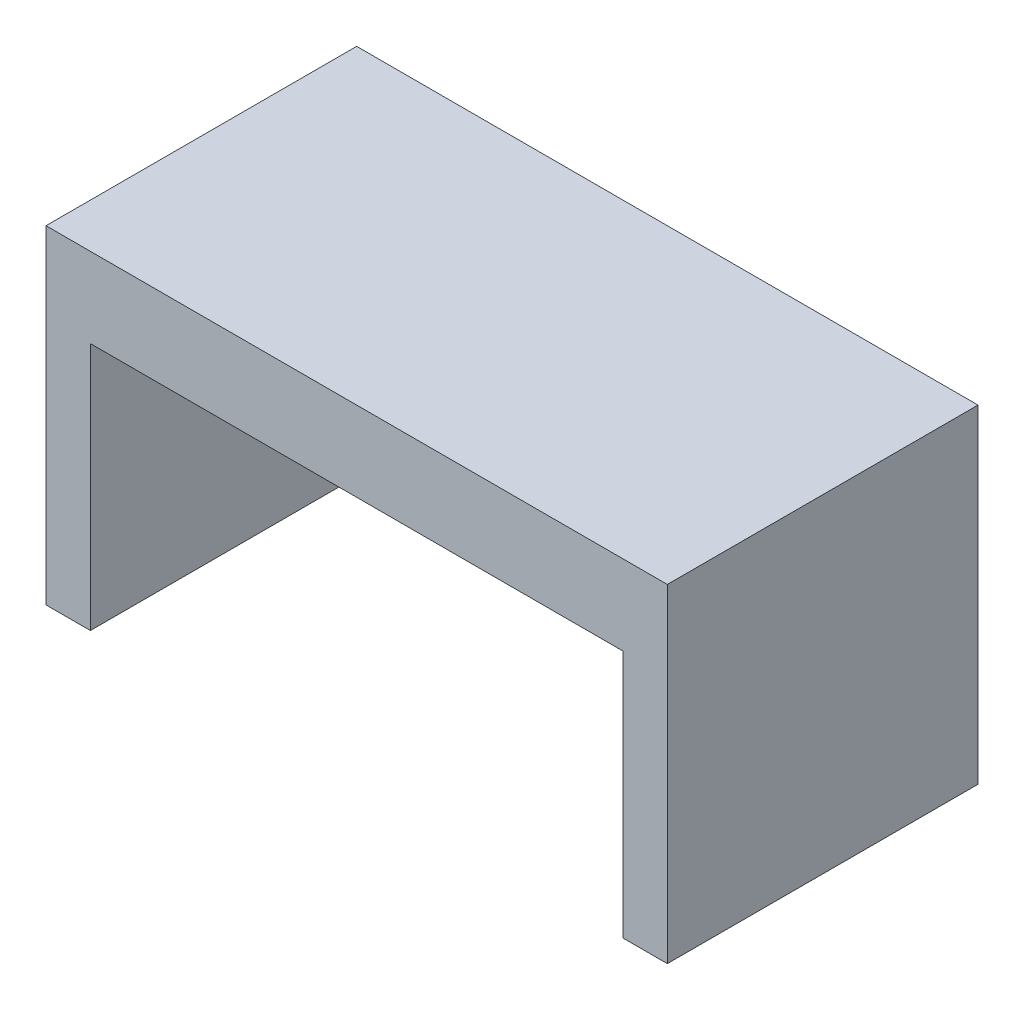
ISO-10303-21;
HEADER;
FILE_DESCRIPTION(('STEP AP214'),'2;1');
FILE_NAME('part.step','',(''),(''),'','','');
FILE_SCHEMA(('AUTOMOTIVE_DESIGN { 1 0 10303 214 1 1 1 1 }'));
ENDSEC;
DATA;
#1=APPLICATION_CONTEXT('core data for automotive mechanical design processes');
#2=APPLICATION_PROTOCOL_DEFINITION('international standard','automotive_design',2000,#1);
#3=PRODUCT_CONTEXT('',#1,'mechanical');
#4=PRODUCT('Part','Part','',(#3));
#5=PRODUCT_RELATED_PRODUCT_CATEGORY('part','',(#4));
#6=PRODUCT_DEFINITION_FORMATION('','',#4);
#7=PRODUCT_DEFINITION_CONTEXT('part definition',#1,'design');
#8=PRODUCT_DEFINITION('design','',#6,#7);
#9=PRODUCT_DEFINITION_SHAPE('','',#8);
#10=(LENGTH_UNIT() NAMED_UNIT(*) SI_UNIT(.MILLI.,.METRE.));
#11=(NAMED_UNIT(*) PLANE_ANGLE_UNIT() SI_UNIT($,.RADIAN.));
#12=(NAMED_UNIT(*) SI_UNIT($,.STERADIAN.) SOLID_ANGLE_UNIT());
#13=UNCERTAINTY_MEASURE_WITH_UNIT(LENGTH_MEASURE(1.E-05),#10,'distance_accuracy_value','');
#14=(GEOMETRIC_REPRESENTATION_CONTEXT(3) GLOBAL_UNCERTAINTY_ASSIGNED_CONTEXT((#13)) GLOBAL_UNIT_ASSIGNED_CONTEXT((#10,
#11,#12)) REPRESENTATION_CONTEXT('',''));
#15=CARTESIAN_POINT('',(0.,0.,0.));
#16=DIRECTION('',(0.,0.,1.));
#17=DIRECTION('',(1.,0.,0.));
#18=AXIS2_PLACEMENT_3D('',#15,#16,#17);
#19=CARTESIAN_POINT('',(-100.,740.,700.));
#20=DIRECTION('',(1.,0.,0.));
#21=DIRECTION('',(0.,1.,0.));
#22=AXIS2_PLACEMENT_3D('',#19,#20,#21);
#23=PLANE('',#22);
#24=DIRECTION('',(0.,-1.,0.));
#25=VECTOR('',#24,1.);
#26=CARTESIAN_POINT('',(-100.,740.,0.));
#27=LINE('',#26,#25);
#28=CARTESIAN_POINT('',(-100.,740.,0.));
#29=VERTEX_POINT('',#28);
#30=CARTESIAN_POINT('',(-100.,0.,0.));
#31=VERTEX_POINT('',#30);
#32=EDGE_CURVE('E132',#29,#31,#27,.T.);
#33=ORIENTED_EDGE('',*,*,#32,.T.);
#34=DIRECTION('',(0.,0.,-1.));
#35=VECTOR('',#34,1.);
#36=CARTESIAN_POINT('',(-100.,0.,700.));
#37=LINE('',#36,#35);
#38=CARTESIAN_POINT('',(-100.,0.,700.));
#39=VERTEX_POINT('',#38);
#40=EDGE_CURVE('E11',#39,#31,#37,.T.);
#41=ORIENTED_EDGE('',*,*,#40,.F.);
#42=DIRECTION('',(0.,-1.,0.));
#43=VECTOR('',#42,1.);
#44=CARTESIAN_POINT('',(-100.,740.,700.));
#45=LINE('',#44,#43);
#46=CARTESIAN_POINT('',(-100.,740.,700.));
#47=VERTEX_POINT('',#46);
#48=EDGE_CURVE('E146',#47,#39,#45,.T.);
#49=ORIENTED_EDGE('',*,*,#48,.F.);
#50=DIRECTION('',(0.,0.,-1.));
#51=VECTOR('',#50,1.);
#52=CARTESIAN_POINT('',(-100.,740.,700.));
#53=LINE('',#52,#51);
#54=EDGE_CURVE('E128',#47,#29,#53,.T.);
#55=ORIENTED_EDGE('',*,*,#54,.T.);
#56=EDGE_LOOP('',(#33,#41,#49,#55));
#57=FACE_BOUND('',#56,.T.);
#58=ADVANCED_FACE('F36',(#57),#23,.F.);
#59=CARTESIAN_POINT('',(-100.,0.,700.));
#60=DIRECTION('',(0.,1.,0.));
#61=DIRECTION('',(0.,0.,1.));
#62=AXIS2_PLACEMENT_3D('',#59,#60,#61);
#63=PLANE('',#62);
#64=DIRECTION('',(1.,0.,0.));
#65=VECTOR('',#64,1.);
#66=CARTESIAN_POINT('',(-100.,0.,0.));
#67=LINE('',#66,#65);
#68=CARTESIAN_POINT('',(0.,0.,0.));
#69=VERTEX_POINT('',#68);
#70=EDGE_CURVE('E135',#31,#69,#67,.T.);
#71=ORIENTED_EDGE('',*,*,#70,.T.);
#72=DIRECTION('',(0.,0.,-1.));
#73=VECTOR('',#72,1.);
#74=CARTESIAN_POINT('',(0.,0.,700.));
#75=LINE('',#74,#73);
#76=CARTESIAN_POINT('',(0.,0.,700.));
#77=VERTEX_POINT('',#76);
#78=EDGE_CURVE('E44',#77,#69,#75,.T.);
#79=ORIENTED_EDGE('',*,*,#78,.F.);
#80=DIRECTION('',(1.,0.,0.));
#81=VECTOR('',#80,1.);
#82=CARTESIAN_POINT('',(-100.,0.,700.));
#83=LINE('',#82,#81);
#84=EDGE_CURVE('E95',#39,#77,#83,.T.);
#85=ORIENTED_EDGE('',*,*,#84,.F.);
#86=ORIENTED_EDGE('',*,*,#40,.T.);
#87=EDGE_LOOP('',(#71,#79,#85,#86));
#88=FACE_BOUND('',#87,.T.);
#89=ADVANCED_FACE('F181',(#88),#63,.F.);
#90=CARTESIAN_POINT('',(0.,0.,700.));
#91=DIRECTION('',(-1.,0.,0.));
#92=DIRECTION('',(0.,0.,1.));
#93=AXIS2_PLACEMENT_3D('',#90,#91,#92);
#94=PLANE('',#93);
#95=DIRECTION('',(0.,1.,0.));
#96=VECTOR('',#95,1.);
#97=CARTESIAN_POINT('',(0.,0.,0.));
#98=LINE('',#97,#96);
#99=CARTESIAN_POINT('',(0.,560.,0.));
#100=VERTEX_POINT('',#99);
#101=EDGE_CURVE('E137',#69,#100,#98,.T.);
#102=ORIENTED_EDGE('',*,*,#101,.T.);
#103=DIRECTION('',(0.,0.,-1.));
#104=VECTOR('',#103,1.);
#105=CARTESIAN_POINT('',(0.,560.,700.));
#106=LINE('',#105,#104);
#107=CARTESIAN_POINT('',(0.,560.,700.));
#108=VERTEX_POINT('',#107);
#109=EDGE_CURVE('E153',#108,#100,#106,.T.);
#110=ORIENTED_EDGE('',*,*,#109,.F.);
#111=DIRECTION('',(0.,1.,0.));
#112=VECTOR('',#111,1.);
#113=CARTESIAN_POINT('',(0.,0.,700.));
#114=LINE('',#113,#112);
#115=EDGE_CURVE('E161',#77,#108,#114,.T.);
#116=ORIENTED_EDGE('',*,*,#115,.F.);
#117=ORIENTED_EDGE('',*,*,#78,.T.);
#118=EDGE_LOOP('',(#102,#110,#116,#117));
#119=FACE_BOUND('',#118,.T.);
#120=ADVANCED_FACE('F159',(#119),#94,.F.);
#121=CARTESIAN_POINT('',(0.,560.,700.));
#122=DIRECTION('',(0.,1.,0.));
#123=DIRECTION('',(0.,0.,1.));
#124=AXIS2_PLACEMENT_3D('',#121,#122,#123);
#125=PLANE('',#124);
#126=DIRECTION('',(1.,0.,0.));
#127=VECTOR('',#126,1.);
#128=CARTESIAN_POINT('',(0.,560.,0.));
#129=LINE('',#128,#127);
#130=CARTESIAN_POINT('',(1200.,560.,0.));
#131=VERTEX_POINT('',#130);
#132=EDGE_CURVE('E139',#100,#131,#129,.T.);
#133=ORIENTED_EDGE('',*,*,#132,.T.);
#134=DIRECTION('',(0.,0.,-1.));
#135=VECTOR('',#134,1.);
#136=CARTESIAN_POINT('',(1200.,560.,700.));
#137=LINE('',#136,#135);
#138=CARTESIAN_POINT('',(1200.,560.,700.));
#139=VERTEX_POINT('',#138);
#140=EDGE_CURVE('E150',#139,#131,#137,.T.);
#141=ORIENTED_EDGE('',*,*,#140,.F.);
#142=DIRECTION('',(1.,0.,0.));
#143=VECTOR('',#142,1.);
#144=CARTESIAN_POINT('',(0.,560.,700.));
#145=LINE('',#144,#143);
#146=EDGE_CURVE('E173',#108,#139,#145,.T.);
#147=ORIENTED_EDGE('',*,*,#146,.F.);
#148=ORIENTED_EDGE('',*,*,#109,.T.);
#149=EDGE_LOOP('',(#133,#141,#147,#148));
#150=FACE_BOUND('',#149,.T.);
#151=ADVANCED_FACE('F169',(#150),#125,.F.);
#152=CARTESIAN_POINT('',(1200.,560.,700.));
#153=DIRECTION('',(1.,0.,0.));
#154=DIRECTION('',(0.,0.,-1.));
#155=AXIS2_PLACEMENT_3D('',#152,#153,#154);
#156=PLANE('',#155);
#157=DIRECTION('',(0.,-1.,0.));
#158=VECTOR('',#157,1.);
#159=CARTESIAN_POINT('',(1200.,560.,0.));
#160=LINE('',#159,#158);
#161=CARTESIAN_POINT('',(1200.,0.,0.));
#162=VERTEX_POINT('',#161);
#163=EDGE_CURVE('E141',#131,#162,#160,.T.);
#164=ORIENTED_EDGE('',*,*,#163,.T.);
#165=DIRECTION('',(0.,0.,-1.));
#166=VECTOR('',#165,1.);
#167=CARTESIAN_POINT('',(1200.,0.,700.));
#168=LINE('',#167,#166);
#169=CARTESIAN_POINT('',(1200.,0.,700.));
#170=VERTEX_POINT('',#169);
#171=EDGE_CURVE('E123',#170,#162,#168,.T.);
#172=ORIENTED_EDGE('',*,*,#171,.F.);
#173=DIRECTION('',(0.,-1.,0.));
#174=VECTOR('',#173,1.);
#175=CARTESIAN_POINT('',(1200.,560.,700.));
#176=LINE('',#175,#174);
#177=EDGE_CURVE('E114',#139,#170,#176,.T.);
#178=ORIENTED_EDGE('',*,*,#177,.F.);
#179=ORIENTED_EDGE('',*,*,#140,.T.);
#180=EDGE_LOOP('',(#164,#172,#178,#179));
#181=FACE_BOUND('',#180,.T.);
#182=ADVANCED_FACE('F172',(#181),#156,.F.);
#183=CARTESIAN_POINT('',(1200.,0.,700.));
#184=DIRECTION('',(0.,1.,0.));
#185=DIRECTION('',(0.,0.,1.));
#186=AXIS2_PLACEMENT_3D('',#183,#184,#185);
#187=PLANE('',#186);
#188=DIRECTION('',(1.,0.,0.));
#189=VECTOR('',#188,1.);
#190=CARTESIAN_POINT('',(1200.,0.,0.));
#191=LINE('',#190,#189);
#192=CARTESIAN_POINT('',(1300.,0.,0.));
#193=VERTEX_POINT('',#192);
#194=EDGE_CURVE('E122',#162,#193,#191,.T.);
#195=ORIENTED_EDGE('',*,*,#194,.T.);
#196=DIRECTION('',(0.,0.,-1.));
#197=VECTOR('',#196,1.);
#198=CARTESIAN_POINT('',(1300.,0.,700.));
#199=LINE('',#198,#197);
#200=CARTESIAN_POINT('',(1300.,0.,700.));
#201=VERTEX_POINT('',#200);
#202=EDGE_CURVE('E119',#201,#193,#199,.T.);
#203=ORIENTED_EDGE('',*,*,#202,.F.);
#204=DIRECTION('',(1.,0.,0.));
#205=VECTOR('',#204,1.);
#206=CARTESIAN_POINT('',(1200.,0.,700.));
#207=LINE('',#206,#205);
#208=EDGE_CURVE('E108',#170,#201,#207,.T.);
#209=ORIENTED_EDGE('',*,*,#208,.F.);
#210=ORIENTED_EDGE('',*,*,#171,.T.);
#211=EDGE_LOOP('',(#195,#203,#209,#210));
#212=FACE_BOUND('',#211,.T.);
#213=ADVANCED_FACE('F120',(#212),#187,.F.);
#214=CARTESIAN_POINT('',(1300.,0.,700.));
#215=DIRECTION('',(-1.,0.,0.));
#216=DIRECTION('',(0.,0.,1.));
#217=AXIS2_PLACEMENT_3D('',#214,#215,#216);
#218=PLANE('',#217);
#219=DIRECTION('',(0.,1.,0.));
#220=VECTOR('',#219,1.);
#221=CARTESIAN_POINT('',(1300.,0.,0.));
#222=LINE('',#221,#220);
#223=CARTESIAN_POINT('',(1300.,740.,0.));
#224=VERTEX_POINT('',#223);
#225=EDGE_CURVE('E81',#193,#224,#222,.T.);
#226=ORIENTED_EDGE('',*,*,#225,.T.);
#227=DIRECTION('',(0.,0.,-1.));
#228=VECTOR('',#227,1.);
#229=CARTESIAN_POINT('',(1300.,740.,700.));
#230=LINE('',#229,#228);
#231=CARTESIAN_POINT('',(1300.,740.,700.));
#232=VERTEX_POINT('',#231);
#233=EDGE_CURVE('E124',#232,#224,#230,.T.);
#234=ORIENTED_EDGE('',*,*,#233,.F.);
#235=DIRECTION('',(0.,1.,0.));
#236=VECTOR('',#235,1.);
#237=CARTESIAN_POINT('',(1300.,0.,700.));
#238=LINE('',#237,#236);
#239=EDGE_CURVE('E112',#201,#232,#238,.T.);
#240=ORIENTED_EDGE('',*,*,#239,.F.);
#241=ORIENTED_EDGE('',*,*,#202,.T.);
#242=EDGE_LOOP('',(#226,#234,#240,#241));
#243=FACE_BOUND('',#242,.T.);
#244=ADVANCED_FACE('F126',(#243),#218,.F.);
#245=CARTESIAN_POINT('',(1300.,740.,700.));
#246=DIRECTION('',(0.,-1.,0.));
#247=DIRECTION('',(1.,0.,0.));
#248=AXIS2_PLACEMENT_3D('',#245,#246,#247);
#249=PLANE('',#248);
#250=DIRECTION('',(-1.,0.,0.));
#251=VECTOR('',#250,1.);
#252=CARTESIAN_POINT('',(1300.,740.,0.));
#253=LINE('',#252,#251);
#254=EDGE_CURVE('E87',#224,#29,#253,.T.);
#255=ORIENTED_EDGE('',*,*,#254,.T.);
#256=ORIENTED_EDGE('',*,*,#54,.F.);
#257=DIRECTION('',(-1.,0.,0.));
#258=VECTOR('',#257,1.);
#259=CARTESIAN_POINT('',(1300.,740.,700.));
#260=LINE('',#259,#258);
#261=EDGE_CURVE('E52',#232,#47,#260,.T.);
#262=ORIENTED_EDGE('',*,*,#261,.F.);
#263=ORIENTED_EDGE('',*,*,#233,.T.);
#264=EDGE_LOOP('',(#255,#256,#262,#263));
#265=FACE_BOUND('',#264,.T.);
#266=ADVANCED_FACE('F197',(#265),#249,.F.);
#267=CARTESIAN_POINT('',(0.,0.,700.));
#268=DIRECTION('',(0.,0.,1.));
#269=DIRECTION('',(1.,0.,0.));
#270=AXIS2_PLACEMENT_3D('',#267,#268,#269);
#271=PLANE('',#270);
#272=ORIENTED_EDGE('',*,*,#48,.T.);
#273=ORIENTED_EDGE('',*,*,#84,.T.);
#274=ORIENTED_EDGE('',*,*,#115,.T.);
#275=ORIENTED_EDGE('',*,*,#146,.T.);
#276=ORIENTED_EDGE('',*,*,#177,.T.);
#277=ORIENTED_EDGE('',*,*,#208,.T.);
#278=ORIENTED_EDGE('',*,*,#239,.T.);
#279=ORIENTED_EDGE('',*,*,#261,.T.);
#280=EDGE_LOOP('',(#272,#273,#274,#275,#276,#277,#278,#279));
#281=FACE_BOUND('',#280,.T.);
#282=ADVANCED_FACE('F110',(#281),#271,.T.);
#283=CARTESIAN_POINT('',(0.,0.,0.));
#284=DIRECTION('',(0.,0.,1.));
#285=DIRECTION('',(1.,0.,0.));
#286=AXIS2_PLACEMENT_3D('',#283,#284,#285);
#287=PLANE('',#286);
#288=ORIENTED_EDGE('',*,*,#32,.F.);
#289=ORIENTED_EDGE('',*,*,#254,.F.);
#290=ORIENTED_EDGE('',*,*,#225,.F.);
#291=ORIENTED_EDGE('',*,*,#194,.F.);
#292=ORIENTED_EDGE('',*,*,#163,.F.);
#293=ORIENTED_EDGE('',*,*,#132,.F.);
#294=ORIENTED_EDGE('',*,*,#101,.F.);
#295=ORIENTED_EDGE('',*,*,#70,.F.);
#296=EDGE_LOOP('',(#288,#289,#290,#291,#292,#293,#294,#295));
#297=FACE_BOUND('',#296,.T.);
#298=ADVANCED_FACE('F165',(#297),#287,.F.);
#299=CLOSED_SHELL('',(#58,#89,#120,#151,#182,#213,#244,#266,#282,#298));
#300=MANIFOLD_SOLID_BREP('B2',#299);
#301=ADVANCED_BREP_SHAPE_REPRESENTATION('',(#18,#300),#14);
#302=SHAPE_DEFINITION_REPRESENTATION(#9,#301);
ENDSEC;
END-ISO-10303-21;
